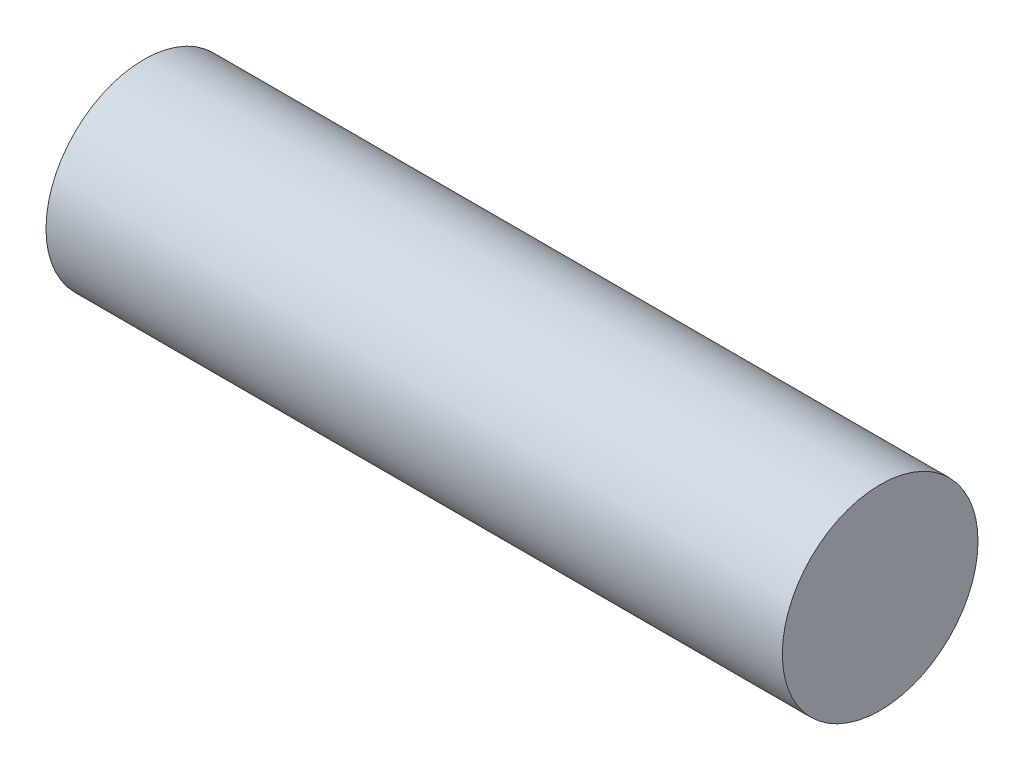
ISO-10303-21;
HEADER;
FILE_DESCRIPTION(('STEP AP214'),'2;1');
FILE_NAME('part.step','',(''),(''),'','','');
FILE_SCHEMA(('AUTOMOTIVE_DESIGN { 1 0 10303 214 1 1 1 1 }'));
ENDSEC;
DATA;
#1=APPLICATION_CONTEXT('core data for automotive mechanical design processes');
#2=APPLICATION_PROTOCOL_DEFINITION('international standard','automotive_design',2000,#1);
#3=PRODUCT_CONTEXT('',#1,'mechanical');
#4=PRODUCT('Part','Part','',(#3));
#5=PRODUCT_RELATED_PRODUCT_CATEGORY('part','',(#4));
#6=PRODUCT_DEFINITION_FORMATION('','',#4);
#7=PRODUCT_DEFINITION_CONTEXT('part definition',#1,'design');
#8=PRODUCT_DEFINITION('design','',#6,#7);
#9=PRODUCT_DEFINITION_SHAPE('','',#8);
#10=(LENGTH_UNIT() NAMED_UNIT(*) SI_UNIT(.MILLI.,.METRE.));
#11=(NAMED_UNIT(*) PLANE_ANGLE_UNIT() SI_UNIT($,.RADIAN.));
#12=(NAMED_UNIT(*) SI_UNIT($,.STERADIAN.) SOLID_ANGLE_UNIT());
#13=UNCERTAINTY_MEASURE_WITH_UNIT(LENGTH_MEASURE(1.E-05),#10,'distance_accuracy_value','');
#14=(GEOMETRIC_REPRESENTATION_CONTEXT(3) GLOBAL_UNCERTAINTY_ASSIGNED_CONTEXT((#13)) GLOBAL_UNIT_ASSIGNED_CONTEXT((#10,
#11,#12)) REPRESENTATION_CONTEXT('',''));
#15=CARTESIAN_POINT('',(0.,0.,0.));
#16=DIRECTION('',(0.,0.,1.));
#17=DIRECTION('',(1.,0.,0.));
#18=AXIS2_PLACEMENT_3D('',#15,#16,#17);
#19=CARTESIAN_POINT('',(70.,0.,0.));
#20=DIRECTION('',(-1.,0.,0.));
#21=DIRECTION('',(0.,0.,1.));
#22=AXIS2_PLACEMENT_3D('',#19,#20,#21);
#23=CYLINDRICAL_SURFACE('',#22,9.3);
#24=CARTESIAN_POINT('',(70.,0.,0.));
#25=DIRECTION('',(1.,0.,0.));
#26=DIRECTION('',(0.,0.,-1.));
#27=AXIS2_PLACEMENT_3D('',#24,#25,#26);
#28=CIRCLE('',#27,9.3);
#29=CARTESIAN_POINT('',(70.,0.,-9.3));
#30=VERTEX_POINT('',#29);
#31=EDGE_CURVE('E10',#30,#30,#28,.T.);
#32=ORIENTED_EDGE('',*,*,#31,.F.);
#33=EDGE_LOOP('',(#32));
#34=FACE_BOUND('',#33,.T.);
#35=CARTESIAN_POINT('',(0.,0.,0.));
#36=DIRECTION('',(1.,0.,0.));
#37=DIRECTION('',(0.,0.,-1.));
#38=AXIS2_PLACEMENT_3D('',#35,#36,#37);
#39=CIRCLE('',#38,9.3);
#40=CARTESIAN_POINT('',(0.,0.,-9.3));
#41=VERTEX_POINT('',#40);
#42=EDGE_CURVE('E34',#41,#41,#39,.T.);
#43=ORIENTED_EDGE('',*,*,#42,.T.);
#44=EDGE_LOOP('',(#43));
#45=FACE_BOUND('',#44,.T.);
#46=ADVANCED_FACE('F31',(#34,#45),#23,.T.);
#47=CARTESIAN_POINT('',(70.,0.,0.));
#48=DIRECTION('',(1.,0.,0.));
#49=DIRECTION('',(0.,0.,-1.));
#50=AXIS2_PLACEMENT_3D('',#47,#48,#49);
#51=PLANE('',#50);
#52=ORIENTED_EDGE('',*,*,#31,.T.);
#53=EDGE_LOOP('',(#52));
#54=FACE_BOUND('',#53,.T.);
#55=ADVANCED_FACE('F46',(#54),#51,.T.);
#56=CARTESIAN_POINT('',(0.,0.,0.));
#57=DIRECTION('',(1.,0.,0.));
#58=DIRECTION('',(0.,0.,-1.));
#59=AXIS2_PLACEMENT_3D('',#56,#57,#58);
#60=PLANE('',#59);
#61=ORIENTED_EDGE('',*,*,#42,.F.);
#62=EDGE_LOOP('',(#61));
#63=FACE_BOUND('',#62,.T.);
#64=ADVANCED_FACE('F44',(#63),#60,.F.);
#65=CLOSED_SHELL('',(#46,#55,#64));
#66=MANIFOLD_SOLID_BREP('B2',#65);
#67=ADVANCED_BREP_SHAPE_REPRESENTATION('',(#18,#66),#14);
#68=SHAPE_DEFINITION_REPRESENTATION(#9,#67);
ENDSEC;
END-ISO-10303-21;
